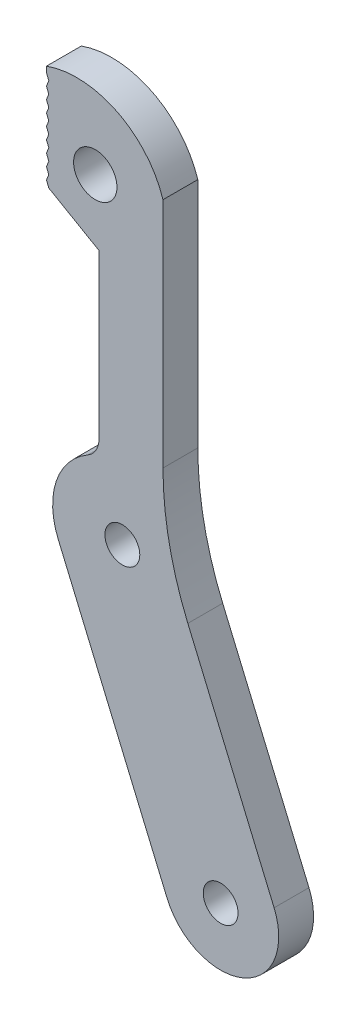
ISO-10303-21;
HEADER;
FILE_DESCRIPTION(('STEP AP214'),'2;1');
FILE_NAME('part.step','',(''),(''),'','','');
FILE_SCHEMA(('AUTOMOTIVE_DESIGN { 1 0 10303 214 1 1 1 1 }'));
ENDSEC;
DATA;
#1=APPLICATION_CONTEXT('core data for automotive mechanical design processes');
#2=APPLICATION_PROTOCOL_DEFINITION('international standard','automotive_design',2000,#1);
#3=PRODUCT_CONTEXT('',#1,'mechanical');
#4=PRODUCT('Part','Part','',(#3));
#5=PRODUCT_RELATED_PRODUCT_CATEGORY('part','',(#4));
#6=PRODUCT_DEFINITION_FORMATION('','',#4);
#7=PRODUCT_DEFINITION_CONTEXT('part definition',#1,'design');
#8=PRODUCT_DEFINITION('design','',#6,#7);
#9=PRODUCT_DEFINITION_SHAPE('','',#8);
#10=(LENGTH_UNIT() NAMED_UNIT(*) SI_UNIT(.MILLI.,.METRE.));
#11=(NAMED_UNIT(*) PLANE_ANGLE_UNIT() SI_UNIT($,.RADIAN.));
#12=(NAMED_UNIT(*) SI_UNIT($,.STERADIAN.) SOLID_ANGLE_UNIT());
#13=UNCERTAINTY_MEASURE_WITH_UNIT(LENGTH_MEASURE(1.E-05),#10,'distance_accuracy_value','');
#14=(GEOMETRIC_REPRESENTATION_CONTEXT(3) GLOBAL_UNCERTAINTY_ASSIGNED_CONTEXT((#13)) GLOBAL_UNIT_ASSIGNED_CONTEXT((#10,
#11,#12)) REPRESENTATION_CONTEXT('',''));
#15=CARTESIAN_POINT('',(0.,0.,0.));
#16=DIRECTION('',(0.,0.,1.));
#17=DIRECTION('',(1.,0.,0.));
#18=AXIS2_PLACEMENT_3D('',#15,#16,#17);
#19=CARTESIAN_POINT('',(18.0463829361262,-3.52698834366382,3.));
#20=DIRECTION('',(0.,0.,-1.));
#21=DIRECTION('',(-1.,0.,0.));
#22=AXIS2_PLACEMENT_3D('',#19,#20,#21);
#23=PLANE('',#22);
#24=DIRECTION('',(0.86602540378444,-0.499999999999998,0.));
#25=VECTOR('',#24,1.);
#26=CARTESIAN_POINT('',(19.9553284785627,-7.68665441141795,3.));
#27=LINE('',#26,#25);
#28=CARTESIAN_POINT('',(15.6252014596405,-5.18665441141796,3.));
#29=VERTEX_POINT('',#28);
#30=CARTESIAN_POINT('',(19.9553284785627,-7.68665441141795,3.));
#31=VERTEX_POINT('',#30);
#32=EDGE_CURVE('E308',#29,#31,#27,.T.);
#33=ORIENTED_EDGE('',*,*,#32,.T.);
#34=DIRECTION('',(0.,-1.,0.));
#35=VECTOR('',#34,1.);
#36=CARTESIAN_POINT('',(19.9553284785627,-21.6866544114179,3.));
#37=LINE('',#36,#35);
#38=CARTESIAN_POINT('',(19.9553284785627,-21.6866544114179,3.));
#39=VERTEX_POINT('',#38);
#40=EDGE_CURVE('E156',#31,#39,#37,.T.);
#41=ORIENTED_EDGE('',*,*,#40,.T.);
#42=CARTESIAN_POINT('',(17.9553284785627,-21.6866544114179,3.));
#43=DIRECTION('',(0.,0.,-1.));
#44=DIRECTION('',(-1.,0.,0.));
#45=AXIS2_PLACEMENT_3D('',#42,#43,#44);
#46=CIRCLE('',#45,2.);
#47=CARTESIAN_POINT('',(18.9561176597661,-23.418249345225,3.));
#48=VERTEX_POINT('',#47);
#49=EDGE_CURVE('E383',#39,#48,#46,.T.);
#50=ORIENTED_EDGE('',*,*,#49,.T.);
#51=CARTESIAN_POINT('',(21.9584852033763,-28.6130341466461,3.));
#52=DIRECTION('',(0.,0.,1.));
#53=DIRECTION('',(1.,0.,0.));
#54=AXIS2_PLACEMENT_3D('',#51,#52,#53);
#55=CIRCLE('',#54,6.);
#56=CARTESIAN_POINT('',(16.4357325722321,-30.9580721794271,3.));
#57=VERTEX_POINT('',#56);
#58=EDGE_CURVE('E402',#48,#57,#55,.T.);
#59=ORIENTED_EDGE('',*,*,#58,.T.);
#60=DIRECTION('',(0.390839672130157,-0.920458771857377,0.));
#61=VECTOR('',#60,1.);
#62=CARTESIAN_POINT('',(16.4357325722321,-30.9580721794271,3.));
#63=LINE('',#62,#61);
#64=CARTESIAN_POINT('',(25.8158847033558,-53.0490827040041,3.));
#65=VERTEX_POINT('',#64);
#66=EDGE_CURVE('E399',#57,#65,#63,.T.);
#67=ORIENTED_EDGE('',*,*,#66,.T.);
#68=CARTESIAN_POINT('',(30.4181785626427,-51.0948843433533,3.));
#69=DIRECTION('',(0.,0.,1.));
#70=DIRECTION('',(1.,0.,0.));
#71=AXIS2_PLACEMENT_3D('',#68,#69,#70);
#72=CIRCLE('',#71,5.);
#73=CARTESIAN_POINT('',(35.0204724219296,-49.1406859827026,3.));
#74=VERTEX_POINT('',#73);
#75=EDGE_CURVE('E401',#65,#74,#72,.T.);
#76=ORIENTED_EDGE('',*,*,#75,.T.);
#77=DIRECTION('',(-0.390839672130157,0.920458771857378,0.));
#78=VECTOR('',#77,1.);
#79=CARTESIAN_POINT('',(35.0204724219296,-49.1406859827026,3.));
#80=LINE('',#79,#78);
#81=CARTESIAN_POINT('',(27.5945186514566,-31.6519693174124,3.));
#82=VERTEX_POINT('',#81);
#83=EDGE_CURVE('E404',#74,#82,#80,.T.);
#84=ORIENTED_EDGE('',*,*,#83,.T.);
#85=CARTESIAN_POINT('',(52.3494338732919,-21.1406859827026,3.));
#86=DIRECTION('',(0.,0.,-1.));
#87=DIRECTION('',(-1.,0.,0.));
#88=AXIS2_PLACEMENT_3D('',#85,#86,#87);
#89=CIRCLE('',#88,26.8941053947292);
#90=CARTESIAN_POINT('',(25.4553284785627,-21.1406859827026,3.));
#91=VERTEX_POINT('',#90);
#92=EDGE_CURVE('E410',#82,#91,#89,.T.);
#93=ORIENTED_EDGE('',*,*,#92,.T.);
#94=DIRECTION('',(0.,1.,0.));
#95=VECTOR('',#94,1.);
#96=CARTESIAN_POINT('',(25.4553284785627,-21.1406859827026,3.));
#97=LINE('',#96,#95);
#98=CARTESIAN_POINT('',(25.4553284785627,-1.14068598270257,3.));
#99=VERTEX_POINT('',#98);
#100=EDGE_CURVE('E412',#91,#99,#97,.T.);
#101=ORIENTED_EDGE('',*,*,#100,.T.);
#102=CARTESIAN_POINT('',(18.0463829361262,-3.52698834366382,3.));
#103=DIRECTION('',(0.,0.,1.));
#104=DIRECTION('',(-1.,0.,0.));
#105=AXIS2_PLACEMENT_3D('',#102,#103,#104);
#106=CIRCLE('',#105,7.78375956776151);
#107=CARTESIAN_POINT('',(15.4252014596405,3.80215353489514,3.));
#108=VERTEX_POINT('',#107);
#109=EDGE_CURVE('E414',#99,#108,#106,.T.);
#110=ORIENTED_EDGE('',*,*,#109,.T.);
#111=DIRECTION('',(0.,-1.,0.));
#112=VECTOR('',#111,1.);
#113=CARTESIAN_POINT('',(15.4252014596405,3.31334558858206,3.));
#114=LINE('',#113,#112);
#115=CARTESIAN_POINT('',(15.4252014596405,3.31334558858206,3.));
#116=VERTEX_POINT('',#115);
#117=EDGE_CURVE('E416',#108,#116,#114,.T.);
#118=ORIENTED_EDGE('',*,*,#117,.T.);
#119=DIRECTION('',(0.371390676354105,-0.928476690885259,0.));
#120=VECTOR('',#119,1.);
#121=CARTESIAN_POINT('',(15.4252014596405,3.31334558858206,3.));
#122=LINE('',#121,#120);
#123=CARTESIAN_POINT('',(15.6252014596405,2.81334558858206,3.));
#124=VERTEX_POINT('',#123);
#125=EDGE_CURVE('E418',#116,#124,#122,.T.);
#126=ORIENTED_EDGE('',*,*,#125,.T.);
#127=DIRECTION('',(-0.371390676354102,-0.92847669088526,0.));
#128=VECTOR('',#127,1.);
#129=CARTESIAN_POINT('',(15.4252014596405,2.31334558858206,3.));
#130=LINE('',#129,#128);
#131=CARTESIAN_POINT('',(15.4252014596405,2.31334558858206,3.));
#132=VERTEX_POINT('',#131);
#133=EDGE_CURVE('E420',#124,#132,#130,.T.);
#134=ORIENTED_EDGE('',*,*,#133,.T.);
#135=DIRECTION('',(0.371390676354105,-0.928476690885259,0.));
#136=VECTOR('',#135,1.);
#137=CARTESIAN_POINT('',(15.4252014596405,2.31334558858206,3.));
#138=LINE('',#137,#136);
#139=CARTESIAN_POINT('',(15.6252014596405,1.81334558858206,3.));
#140=VERTEX_POINT('',#139);
#141=EDGE_CURVE('E422',#132,#140,#138,.T.);
#142=ORIENTED_EDGE('',*,*,#141,.T.);
#143=DIRECTION('',(-0.371390676354102,-0.92847669088526,0.));
#144=VECTOR('',#143,1.);
#145=CARTESIAN_POINT('',(15.4252014596405,1.31334558858206,3.));
#146=LINE('',#145,#144);
#147=CARTESIAN_POINT('',(15.4252014596405,1.31334558858206,3.));
#148=VERTEX_POINT('',#147);
#149=EDGE_CURVE('E424',#140,#148,#146,.T.);
#150=ORIENTED_EDGE('',*,*,#149,.T.);
#151=DIRECTION('',(0.371390676354105,-0.928476690885259,0.));
#152=VECTOR('',#151,1.);
#153=CARTESIAN_POINT('',(15.4252014596405,1.31334558858206,3.));
#154=LINE('',#153,#152);
#155=CARTESIAN_POINT('',(15.6252014596405,0.813345588582054,3.));
#156=VERTEX_POINT('',#155);
#157=EDGE_CURVE('E426',#148,#156,#154,.T.);
#158=ORIENTED_EDGE('',*,*,#157,.T.);
#159=DIRECTION('',(-0.371390676354102,-0.92847669088526,0.));
#160=VECTOR('',#159,1.);
#161=CARTESIAN_POINT('',(15.4252014596405,0.313345588582054,3.));
#162=LINE('',#161,#160);
#163=CARTESIAN_POINT('',(15.4252014596405,0.313345588582054,3.));
#164=VERTEX_POINT('',#163);
#165=EDGE_CURVE('E428',#156,#164,#162,.T.);
#166=ORIENTED_EDGE('',*,*,#165,.T.);
#167=DIRECTION('',(0.371390676354105,-0.928476690885259,0.));
#168=VECTOR('',#167,1.);
#169=CARTESIAN_POINT('',(15.4252014596405,0.313345588582054,3.));
#170=LINE('',#169,#168);
#171=CARTESIAN_POINT('',(15.6252014596405,-0.186654411417949,3.));
#172=VERTEX_POINT('',#171);
#173=EDGE_CURVE('E430',#164,#172,#170,.T.);
#174=ORIENTED_EDGE('',*,*,#173,.T.);
#175=DIRECTION('',(-0.371390676354102,-0.92847669088526,0.));
#176=VECTOR('',#175,1.);
#177=CARTESIAN_POINT('',(15.4252014596405,-0.686654411417948,3.));
#178=LINE('',#177,#176);
#179=CARTESIAN_POINT('',(15.4252014596405,-0.686654411417948,3.));
#180=VERTEX_POINT('',#179);
#181=EDGE_CURVE('E432',#172,#180,#178,.T.);
#182=ORIENTED_EDGE('',*,*,#181,.T.);
#183=DIRECTION('',(0.371390676354105,-0.928476690885259,0.));
#184=VECTOR('',#183,1.);
#185=CARTESIAN_POINT('',(15.4252014596405,-0.686654411417948,3.));
#186=LINE('',#185,#184);
#187=CARTESIAN_POINT('',(15.6252014596405,-1.18665441141795,3.));
#188=VERTEX_POINT('',#187);
#189=EDGE_CURVE('E434',#180,#188,#186,.T.);
#190=ORIENTED_EDGE('',*,*,#189,.T.);
#191=DIRECTION('',(-0.371390676354102,-0.92847669088526,0.));
#192=VECTOR('',#191,1.);
#193=CARTESIAN_POINT('',(15.4252014596405,-1.68665441141795,3.));
#194=LINE('',#193,#192);
#195=CARTESIAN_POINT('',(15.4252014596405,-1.68665441141795,3.));
#196=VERTEX_POINT('',#195);
#197=EDGE_CURVE('E436',#188,#196,#194,.T.);
#198=ORIENTED_EDGE('',*,*,#197,.T.);
#199=DIRECTION('',(0.371390676354105,-0.928476690885259,0.));
#200=VECTOR('',#199,1.);
#201=CARTESIAN_POINT('',(15.4252014596405,-1.68665441141795,3.));
#202=LINE('',#201,#200);
#203=CARTESIAN_POINT('',(15.6252014596405,-2.18665441141796,3.));
#204=VERTEX_POINT('',#203);
#205=EDGE_CURVE('E438',#196,#204,#202,.T.);
#206=ORIENTED_EDGE('',*,*,#205,.T.);
#207=DIRECTION('',(-0.371390676354102,-0.92847669088526,0.));
#208=VECTOR('',#207,1.);
#209=CARTESIAN_POINT('',(15.4252014596405,-2.68665441141795,3.));
#210=LINE('',#209,#208);
#211=CARTESIAN_POINT('',(15.4252014596405,-2.68665441141795,3.));
#212=VERTEX_POINT('',#211);
#213=EDGE_CURVE('E440',#204,#212,#210,.T.);
#214=ORIENTED_EDGE('',*,*,#213,.T.);
#215=DIRECTION('',(0.371390676354105,-0.928476690885259,0.));
#216=VECTOR('',#215,1.);
#217=CARTESIAN_POINT('',(15.4252014596405,-2.68665441141795,3.));
#218=LINE('',#217,#216);
#219=CARTESIAN_POINT('',(15.6252014596405,-3.18665441141796,3.));
#220=VERTEX_POINT('',#219);
#221=EDGE_CURVE('E442',#212,#220,#218,.T.);
#222=ORIENTED_EDGE('',*,*,#221,.T.);
#223=DIRECTION('',(-0.371390676354102,-0.92847669088526,0.));
#224=VECTOR('',#223,1.);
#225=CARTESIAN_POINT('',(15.4252014596405,-3.68665441141796,3.));
#226=LINE('',#225,#224);
#227=CARTESIAN_POINT('',(15.4252014596405,-3.68665441141796,3.));
#228=VERTEX_POINT('',#227);
#229=EDGE_CURVE('E235',#220,#228,#226,.T.);
#230=ORIENTED_EDGE('',*,*,#229,.T.);
#231=DIRECTION('',(0.371390676354105,-0.928476690885259,0.));
#232=VECTOR('',#231,1.);
#233=CARTESIAN_POINT('',(15.4252014596405,-3.68665441141796,3.));
#234=LINE('',#233,#232);
#235=CARTESIAN_POINT('',(15.6252014596405,-4.18665441141796,3.));
#236=VERTEX_POINT('',#235);
#237=EDGE_CURVE('E229',#228,#236,#234,.T.);
#238=ORIENTED_EDGE('',*,*,#237,.T.);
#239=DIRECTION('',(-0.371390676354102,-0.92847669088526,0.));
#240=VECTOR('',#239,1.);
#241=CARTESIAN_POINT('',(15.4252014596405,-4.68665441141796,3.));
#242=LINE('',#241,#240);
#243=CARTESIAN_POINT('',(15.4252014596405,-4.68665441141796,3.));
#244=VERTEX_POINT('',#243);
#245=EDGE_CURVE('E233',#236,#244,#242,.T.);
#246=ORIENTED_EDGE('',*,*,#245,.T.);
#247=DIRECTION('',(0.371390676354102,-0.92847669088526,0.));
#248=VECTOR('',#247,1.);
#249=CARTESIAN_POINT('',(15.4252014596405,-4.68665441141796,3.));
#250=LINE('',#249,#248);
#251=EDGE_CURVE('E53',#244,#29,#250,.T.);
#252=ORIENTED_EDGE('',*,*,#251,.T.);
#253=EDGE_LOOP('',(#33,#41,#50,#59,#67,#76,#84,#93,#101,#110,#118,#126,#134,#142,#150,#158,#166,
#174,#182,#190,#198,#206,#214,#222,#230,#238,#246,#252));
#254=FACE_BOUND('',#253,.T.);
#255=CARTESIAN_POINT('',(21.9584852033763,-28.6130341466461,3.));
#256=DIRECTION('',(0.,0.,1.));
#257=DIRECTION('',(1.,0.,0.));
#258=AXIS2_PLACEMENT_3D('',#255,#256,#257);
#259=CIRCLE('',#258,1.5);
#260=CARTESIAN_POINT('',(23.4584852033763,-28.6130341466461,3.));
#261=VERTEX_POINT('',#260);
#262=EDGE_CURVE('E257',#261,#261,#259,.T.);
#263=ORIENTED_EDGE('',*,*,#262,.F.);
#264=EDGE_LOOP('',(#263));
#265=FACE_BOUND('',#264,.T.);
#266=CARTESIAN_POINT('',(30.4181785626427,-51.0948843433533,3.));
#267=DIRECTION('',(0.,0.,1.));
#268=DIRECTION('',(1.,0.,0.));
#269=AXIS2_PLACEMENT_3D('',#266,#267,#268);
#270=CIRCLE('',#269,1.5);
#271=CARTESIAN_POINT('',(31.9181785626427,-51.0948843433533,3.));
#272=VERTEX_POINT('',#271);
#273=EDGE_CURVE('E496',#272,#272,#270,.T.);
#274=ORIENTED_EDGE('',*,*,#273,.F.);
#275=EDGE_LOOP('',(#274));
#276=FACE_BOUND('',#275,.T.);
#277=CARTESIAN_POINT('',(19.6252014596405,-2.18665441141797,3.));
#278=DIRECTION('',(0.,0.,1.));
#279=DIRECTION('',(1.,0.,0.));
#280=AXIS2_PLACEMENT_3D('',#277,#278,#279);
#281=CIRCLE('',#280,1.86677313911568);
#282=CARTESIAN_POINT('',(21.4919745987562,-2.18665441141797,3.));
#283=VERTEX_POINT('',#282);
#284=EDGE_CURVE('E487',#283,#283,#281,.T.);
#285=ORIENTED_EDGE('',*,*,#284,.F.);
#286=EDGE_LOOP('',(#285));
#287=FACE_BOUND('',#286,.T.);
#288=ADVANCED_FACE('F36',(#254,#265,#276,#287),#23,.F.);
#289=CARTESIAN_POINT('',(18.0463829361262,-3.52698834366382,0.));
#290=DIRECTION('',(0.,0.,-1.));
#291=DIRECTION('',(-1.,0.,0.));
#292=AXIS2_PLACEMENT_3D('',#289,#290,#291);
#293=PLANE('',#292);
#294=CARTESIAN_POINT('',(30.4181785626427,-51.0948843433533,0.));
#295=DIRECTION('',(0.,0.,1.));
#296=DIRECTION('',(1.,0.,0.));
#297=AXIS2_PLACEMENT_3D('',#294,#295,#296);
#298=CIRCLE('',#297,1.5);
#299=CARTESIAN_POINT('',(31.9181785626427,-51.0948843433533,0.));
#300=VERTEX_POINT('',#299);
#301=EDGE_CURVE('E493',#300,#300,#298,.T.);
#302=ORIENTED_EDGE('',*,*,#301,.T.);
#303=EDGE_LOOP('',(#302));
#304=FACE_BOUND('',#303,.T.);
#305=DIRECTION('',(0.86602540378444,-0.499999999999998,0.));
#306=VECTOR('',#305,1.);
#307=CARTESIAN_POINT('',(19.9553284785627,-7.68665441141795,0.));
#308=LINE('',#307,#306);
#309=CARTESIAN_POINT('',(15.6252014596405,-5.18665441141796,0.));
#310=VERTEX_POINT('',#309);
#311=CARTESIAN_POINT('',(19.9553284785627,-7.68665441141795,0.));
#312=VERTEX_POINT('',#311);
#313=EDGE_CURVE('E253',#310,#312,#308,.T.);
#314=ORIENTED_EDGE('',*,*,#313,.F.);
#315=DIRECTION('',(0.371390676354102,-0.92847669088526,0.));
#316=VECTOR('',#315,1.);
#317=CARTESIAN_POINT('',(15.4252014596405,-4.68665441141796,0.));
#318=LINE('',#317,#316);
#319=CARTESIAN_POINT('',(15.4252014596405,-4.68665441141796,0.));
#320=VERTEX_POINT('',#319);
#321=EDGE_CURVE('E148',#320,#310,#318,.T.);
#322=ORIENTED_EDGE('',*,*,#321,.F.);
#323=DIRECTION('',(-0.371390676354102,-0.92847669088526,0.));
#324=VECTOR('',#323,1.);
#325=CARTESIAN_POINT('',(15.4252014596405,-4.68665441141796,0.));
#326=LINE('',#325,#324);
#327=CARTESIAN_POINT('',(15.6252014596405,-4.18665441141796,0.));
#328=VERTEX_POINT('',#327);
#329=EDGE_CURVE('E142',#328,#320,#326,.T.);
#330=ORIENTED_EDGE('',*,*,#329,.F.);
#331=DIRECTION('',(0.371390676354105,-0.928476690885259,0.));
#332=VECTOR('',#331,1.);
#333=CARTESIAN_POINT('',(15.4252014596405,-3.68665441141796,0.));
#334=LINE('',#333,#332);
#335=CARTESIAN_POINT('',(15.4252014596405,-3.68665441141796,0.));
#336=VERTEX_POINT('',#335);
#337=EDGE_CURVE('E243',#336,#328,#334,.T.);
#338=ORIENTED_EDGE('',*,*,#337,.F.);
#339=DIRECTION('',(-0.371390676354102,-0.92847669088526,0.));
#340=VECTOR('',#339,1.);
#341=CARTESIAN_POINT('',(15.4252014596405,-3.68665441141796,0.));
#342=LINE('',#341,#340);
#343=CARTESIAN_POINT('',(15.6252014596405,-3.18665441141796,0.));
#344=VERTEX_POINT('',#343);
#345=EDGE_CURVE('E303',#344,#336,#342,.T.);
#346=ORIENTED_EDGE('',*,*,#345,.F.);
#347=DIRECTION('',(0.371390676354105,-0.928476690885259,0.));
#348=VECTOR('',#347,1.);
#349=CARTESIAN_POINT('',(15.4252014596405,-2.68665441141795,0.));
#350=LINE('',#349,#348);
#351=CARTESIAN_POINT('',(15.4252014596405,-2.68665441141795,0.));
#352=VERTEX_POINT('',#351);
#353=EDGE_CURVE('E301',#352,#344,#350,.T.);
#354=ORIENTED_EDGE('',*,*,#353,.F.);
#355=DIRECTION('',(-0.371390676354102,-0.92847669088526,0.));
#356=VECTOR('',#355,1.);
#357=CARTESIAN_POINT('',(15.4252014596405,-2.68665441141795,0.));
#358=LINE('',#357,#356);
#359=CARTESIAN_POINT('',(15.6252014596405,-2.18665441141796,0.));
#360=VERTEX_POINT('',#359);
#361=EDGE_CURVE('E299',#360,#352,#358,.T.);
#362=ORIENTED_EDGE('',*,*,#361,.F.);
#363=DIRECTION('',(0.371390676354105,-0.928476690885259,0.));
#364=VECTOR('',#363,1.);
#365=CARTESIAN_POINT('',(15.4252014596405,-1.68665441141795,0.));
#366=LINE('',#365,#364);
#367=CARTESIAN_POINT('',(15.4252014596405,-1.68665441141795,0.));
#368=VERTEX_POINT('',#367);
#369=EDGE_CURVE('E297',#368,#360,#366,.T.);
#370=ORIENTED_EDGE('',*,*,#369,.F.);
#371=DIRECTION('',(-0.371390676354102,-0.92847669088526,0.));
#372=VECTOR('',#371,1.);
#373=CARTESIAN_POINT('',(15.4252014596405,-1.68665441141795,0.));
#374=LINE('',#373,#372);
#375=CARTESIAN_POINT('',(15.6252014596405,-1.18665441141795,0.));
#376=VERTEX_POINT('',#375);
#377=EDGE_CURVE('E295',#376,#368,#374,.T.);
#378=ORIENTED_EDGE('',*,*,#377,.F.);
#379=DIRECTION('',(0.371390676354105,-0.928476690885259,0.));
#380=VECTOR('',#379,1.);
#381=CARTESIAN_POINT('',(15.4252014596405,-0.686654411417948,0.));
#382=LINE('',#381,#380);
#383=CARTESIAN_POINT('',(15.4252014596405,-0.686654411417948,0.));
#384=VERTEX_POINT('',#383);
#385=EDGE_CURVE('E293',#384,#376,#382,.T.);
#386=ORIENTED_EDGE('',*,*,#385,.F.);
#387=DIRECTION('',(-0.371390676354102,-0.92847669088526,0.));
#388=VECTOR('',#387,1.);
#389=CARTESIAN_POINT('',(15.4252014596405,-0.686654411417948,0.));
#390=LINE('',#389,#388);
#391=CARTESIAN_POINT('',(15.6252014596405,-0.186654411417949,0.));
#392=VERTEX_POINT('',#391);
#393=EDGE_CURVE('E291',#392,#384,#390,.T.);
#394=ORIENTED_EDGE('',*,*,#393,.F.);
#395=DIRECTION('',(0.371390676354105,-0.928476690885259,0.));
#396=VECTOR('',#395,1.);
#397=CARTESIAN_POINT('',(15.4252014596405,0.313345588582054,0.));
#398=LINE('',#397,#396);
#399=CARTESIAN_POINT('',(15.4252014596405,0.313345588582054,0.));
#400=VERTEX_POINT('',#399);
#401=EDGE_CURVE('E289',#400,#392,#398,.T.);
#402=ORIENTED_EDGE('',*,*,#401,.F.);
#403=DIRECTION('',(-0.371390676354102,-0.92847669088526,0.));
#404=VECTOR('',#403,1.);
#405=CARTESIAN_POINT('',(15.4252014596405,0.313345588582054,0.));
#406=LINE('',#405,#404);
#407=CARTESIAN_POINT('',(15.6252014596405,0.813345588582054,0.));
#408=VERTEX_POINT('',#407);
#409=EDGE_CURVE('E287',#408,#400,#406,.T.);
#410=ORIENTED_EDGE('',*,*,#409,.F.);
#411=DIRECTION('',(0.371390676354105,-0.928476690885259,0.));
#412=VECTOR('',#411,1.);
#413=CARTESIAN_POINT('',(15.4252014596405,1.31334558858206,0.));
#414=LINE('',#413,#412);
#415=CARTESIAN_POINT('',(15.4252014596405,1.31334558858206,0.));
#416=VERTEX_POINT('',#415);
#417=EDGE_CURVE('E285',#416,#408,#414,.T.);
#418=ORIENTED_EDGE('',*,*,#417,.F.);
#419=DIRECTION('',(-0.371390676354102,-0.92847669088526,0.));
#420=VECTOR('',#419,1.);
#421=CARTESIAN_POINT('',(15.4252014596405,1.31334558858206,0.));
#422=LINE('',#421,#420);
#423=CARTESIAN_POINT('',(15.6252014596405,1.81334558858206,0.));
#424=VERTEX_POINT('',#423);
#425=EDGE_CURVE('E283',#424,#416,#422,.T.);
#426=ORIENTED_EDGE('',*,*,#425,.F.);
#427=DIRECTION('',(0.371390676354105,-0.928476690885259,0.));
#428=VECTOR('',#427,1.);
#429=CARTESIAN_POINT('',(15.4252014596405,2.31334558858206,0.));
#430=LINE('',#429,#428);
#431=CARTESIAN_POINT('',(15.4252014596405,2.31334558858206,0.));
#432=VERTEX_POINT('',#431);
#433=EDGE_CURVE('E281',#432,#424,#430,.T.);
#434=ORIENTED_EDGE('',*,*,#433,.F.);
#435=DIRECTION('',(-0.371390676354102,-0.92847669088526,0.));
#436=VECTOR('',#435,1.);
#437=CARTESIAN_POINT('',(15.4252014596405,2.31334558858206,0.));
#438=LINE('',#437,#436);
#439=CARTESIAN_POINT('',(15.6252014596405,2.81334558858206,0.));
#440=VERTEX_POINT('',#439);
#441=EDGE_CURVE('E279',#440,#432,#438,.T.);
#442=ORIENTED_EDGE('',*,*,#441,.F.);
#443=DIRECTION('',(0.371390676354105,-0.928476690885259,0.));
#444=VECTOR('',#443,1.);
#445=CARTESIAN_POINT('',(15.4252014596405,3.31334558858206,0.));
#446=LINE('',#445,#444);
#447=CARTESIAN_POINT('',(15.4252014596405,3.31334558858206,0.));
#448=VERTEX_POINT('',#447);
#449=EDGE_CURVE('E277',#448,#440,#446,.T.);
#450=ORIENTED_EDGE('',*,*,#449,.F.);
#451=DIRECTION('',(0.,-1.,0.));
#452=VECTOR('',#451,1.);
#453=CARTESIAN_POINT('',(15.4252014596405,3.31334558858206,0.));
#454=LINE('',#453,#452);
#455=CARTESIAN_POINT('',(15.4252014596405,3.80215353489514,0.));
#456=VERTEX_POINT('',#455);
#457=EDGE_CURVE('E275',#456,#448,#454,.T.);
#458=ORIENTED_EDGE('',*,*,#457,.F.);
#459=CARTESIAN_POINT('',(18.0463829361262,-3.52698834366382,0.));
#460=DIRECTION('',(0.,0.,1.));
#461=DIRECTION('',(-1.,0.,0.));
#462=AXIS2_PLACEMENT_3D('',#459,#460,#461);
#463=CIRCLE('',#462,7.78375956776151);
#464=CARTESIAN_POINT('',(25.4553284785627,-1.14068598270257,0.));
#465=VERTEX_POINT('',#464);
#466=EDGE_CURVE('E273',#465,#456,#463,.T.);
#467=ORIENTED_EDGE('',*,*,#466,.F.);
#468=DIRECTION('',(0.,1.,0.));
#469=VECTOR('',#468,1.);
#470=CARTESIAN_POINT('',(25.4553284785627,-21.1406859827026,0.));
#471=LINE('',#470,#469);
#472=CARTESIAN_POINT('',(25.4553284785627,-21.1406859827026,0.));
#473=VERTEX_POINT('',#472);
#474=EDGE_CURVE('E271',#473,#465,#471,.T.);
#475=ORIENTED_EDGE('',*,*,#474,.F.);
#476=CARTESIAN_POINT('',(52.3494338732919,-21.1406859827026,0.));
#477=DIRECTION('',(0.,0.,-1.));
#478=DIRECTION('',(-1.,0.,0.));
#479=AXIS2_PLACEMENT_3D('',#476,#477,#478);
#480=CIRCLE('',#479,26.8941053947292);
#481=CARTESIAN_POINT('',(27.5945186514566,-31.6519693174124,0.));
#482=VERTEX_POINT('',#481);
#483=EDGE_CURVE('E269',#482,#473,#480,.T.);
#484=ORIENTED_EDGE('',*,*,#483,.F.);
#485=DIRECTION('',(-0.390839672130157,0.920458771857378,0.));
#486=VECTOR('',#485,1.);
#487=CARTESIAN_POINT('',(35.0204724219296,-49.1406859827026,0.));
#488=LINE('',#487,#486);
#489=CARTESIAN_POINT('',(35.0204724219296,-49.1406859827026,0.));
#490=VERTEX_POINT('',#489);
#491=EDGE_CURVE('E267',#490,#482,#488,.T.);
#492=ORIENTED_EDGE('',*,*,#491,.F.);
#493=CARTESIAN_POINT('',(30.4181785626427,-51.0948843433533,0.));
#494=DIRECTION('',(0.,0.,1.));
#495=DIRECTION('',(1.,0.,0.));
#496=AXIS2_PLACEMENT_3D('',#493,#494,#495);
#497=CIRCLE('',#496,5.);
#498=CARTESIAN_POINT('',(25.8158847033558,-53.0490827040041,0.));
#499=VERTEX_POINT('',#498);
#500=EDGE_CURVE('E265',#499,#490,#497,.T.);
#501=ORIENTED_EDGE('',*,*,#500,.F.);
#502=DIRECTION('',(0.390839672130157,-0.920458771857377,0.));
#503=VECTOR('',#502,1.);
#504=CARTESIAN_POINT('',(16.4357325722321,-30.9580721794271,0.));
#505=LINE('',#504,#503);
#506=CARTESIAN_POINT('',(16.4357325722321,-30.9580721794271,0.));
#507=VERTEX_POINT('',#506);
#508=EDGE_CURVE('E263',#507,#499,#505,.T.);
#509=ORIENTED_EDGE('',*,*,#508,.F.);
#510=CARTESIAN_POINT('',(21.9584852033763,-28.6130341466461,0.));
#511=DIRECTION('',(0.,0.,1.));
#512=DIRECTION('',(1.,0.,0.));
#513=AXIS2_PLACEMENT_3D('',#510,#511,#512);
#514=CIRCLE('',#513,6.);
#515=CARTESIAN_POINT('',(18.9561176597661,-23.418249345225,0.));
#516=VERTEX_POINT('',#515);
#517=EDGE_CURVE('E261',#516,#507,#514,.T.);
#518=ORIENTED_EDGE('',*,*,#517,.F.);
#519=CARTESIAN_POINT('',(17.9553284785627,-21.6866544114179,0.));
#520=DIRECTION('',(0.,0.,-1.));
#521=DIRECTION('',(-1.,0.,0.));
#522=AXIS2_PLACEMENT_3D('',#519,#520,#521);
#523=CIRCLE('',#522,2.);
#524=CARTESIAN_POINT('',(19.9553284785627,-21.6866544114179,0.));
#525=VERTEX_POINT('',#524);
#526=EDGE_CURVE('E259',#525,#516,#523,.T.);
#527=ORIENTED_EDGE('',*,*,#526,.F.);
#528=DIRECTION('',(0.,-1.,0.));
#529=VECTOR('',#528,1.);
#530=CARTESIAN_POINT('',(19.9553284785627,-21.6866544114179,0.));
#531=LINE('',#530,#529);
#532=EDGE_CURVE('E256',#312,#525,#531,.T.);
#533=ORIENTED_EDGE('',*,*,#532,.F.);
#534=EDGE_LOOP('',(#314,#322,#330,#338,#346,#354,#362,#370,#378,#386,#394,#402,#410,#418,#426,
#434,#442,#450,#458,#467,#475,#484,#492,#501,#509,#518,#527,#533));
#535=FACE_BOUND('',#534,.T.);
#536=CARTESIAN_POINT('',(21.9584852033763,-28.6130341466461,0.));
#537=DIRECTION('',(0.,0.,1.));
#538=DIRECTION('',(1.,0.,0.));
#539=AXIS2_PLACEMENT_3D('',#536,#537,#538);
#540=CIRCLE('',#539,1.5);
#541=CARTESIAN_POINT('',(23.4584852033763,-28.6130341466461,0.));
#542=VERTEX_POINT('',#541);
#543=EDGE_CURVE('E499',#542,#542,#540,.T.);
#544=ORIENTED_EDGE('',*,*,#543,.T.);
#545=EDGE_LOOP('',(#544));
#546=FACE_BOUND('',#545,.T.);
#547=CARTESIAN_POINT('',(19.6252014596405,-2.18665441141797,0.));
#548=DIRECTION('',(0.,0.,1.));
#549=DIRECTION('',(1.,0.,0.));
#550=AXIS2_PLACEMENT_3D('',#547,#548,#549);
#551=CIRCLE('',#550,1.86677313911568);
#552=CARTESIAN_POINT('',(21.4919745987562,-2.18665441141797,0.));
#553=VERTEX_POINT('',#552);
#554=EDGE_CURVE('E490',#553,#553,#551,.T.);
#555=ORIENTED_EDGE('',*,*,#554,.T.);
#556=EDGE_LOOP('',(#555));
#557=FACE_BOUND('',#556,.T.);
#558=ADVANCED_FACE('F387',(#304,#535,#546,#557),#293,.T.);
#559=CARTESIAN_POINT('',(19.9553284785627,-7.68665441141795,3.));
#560=DIRECTION('',(0.499999999999998,0.86602540378444,0.));
#561=DIRECTION('',(-0.86602540378444,0.499999999999998,0.));
#562=AXIS2_PLACEMENT_3D('',#559,#560,#561);
#563=PLANE('',#562);
#564=ORIENTED_EDGE('',*,*,#313,.T.);
#565=DIRECTION('',(0.,0.,-1.));
#566=VECTOR('',#565,1.);
#567=CARTESIAN_POINT('',(19.9553284785627,-7.68665441141795,3.));
#568=LINE('',#567,#566);
#569=EDGE_CURVE('E11',#31,#312,#568,.T.);
#570=ORIENTED_EDGE('',*,*,#569,.F.);
#571=ORIENTED_EDGE('',*,*,#32,.F.);
#572=DIRECTION('',(0.,0.,-1.));
#573=VECTOR('',#572,1.);
#574=CARTESIAN_POINT('',(15.6252014596405,-5.18665441141796,3.));
#575=LINE('',#574,#573);
#576=EDGE_CURVE('E249',#29,#310,#575,.T.);
#577=ORIENTED_EDGE('',*,*,#576,.T.);
#578=EDGE_LOOP('',(#564,#570,#571,#577));
#579=FACE_BOUND('',#578,.T.);
#580=ADVANCED_FACE('F38',(#579),#563,.F.);
#581=CARTESIAN_POINT('',(19.9553284785627,-21.6866544114179,3.));
#582=DIRECTION('',(1.,0.,0.));
#583=DIRECTION('',(0.,1.,0.));
#584=AXIS2_PLACEMENT_3D('',#581,#582,#583);
#585=PLANE('',#584);
#586=ORIENTED_EDGE('',*,*,#532,.T.);
#587=DIRECTION('',(0.,0.,-1.));
#588=VECTOR('',#587,1.);
#589=CARTESIAN_POINT('',(19.9553284785627,-21.6866544114179,3.));
#590=LINE('',#589,#588);
#591=EDGE_CURVE('E45',#39,#525,#590,.T.);
#592=ORIENTED_EDGE('',*,*,#591,.F.);
#593=ORIENTED_EDGE('',*,*,#40,.F.);
#594=ORIENTED_EDGE('',*,*,#569,.T.);
#595=EDGE_LOOP('',(#586,#592,#593,#594));
#596=FACE_BOUND('',#595,.T.);
#597=ADVANCED_FACE('F762',(#596),#585,.F.);
#598=CARTESIAN_POINT('',(17.9553284785627,-21.6866544114179,3.));
#599=DIRECTION('',(0.,0.,-1.));
#600=DIRECTION('',(-1.,0.,0.));
#601=AXIS2_PLACEMENT_3D('',#598,#599,#600);
#602=CYLINDRICAL_SURFACE('',#601,2.);
#603=ORIENTED_EDGE('',*,*,#526,.T.);
#604=DIRECTION('',(0.,0.,-1.));
#605=VECTOR('',#604,1.);
#606=CARTESIAN_POINT('',(18.9561176597661,-23.418249345225,3.));
#607=LINE('',#606,#605);
#608=EDGE_CURVE('E375',#48,#516,#607,.T.);
#609=ORIENTED_EDGE('',*,*,#608,.F.);
#610=ORIENTED_EDGE('',*,*,#49,.F.);
#611=ORIENTED_EDGE('',*,*,#591,.T.);
#612=EDGE_LOOP('',(#603,#609,#610,#611));
#613=FACE_BOUND('',#612,.T.);
#614=ADVANCED_FACE('F381',(#613),#602,.F.);
#615=CARTESIAN_POINT('',(21.9584852033763,-28.6130341466461,3.));
#616=DIRECTION('',(0.,0.,-1.));
#617=DIRECTION('',(-1.,0.,0.));
#618=AXIS2_PLACEMENT_3D('',#615,#616,#617);
#619=CYLINDRICAL_SURFACE('',#618,6.);
#620=ORIENTED_EDGE('',*,*,#517,.T.);
#621=DIRECTION('',(0.,0.,-1.));
#622=VECTOR('',#621,1.);
#623=CARTESIAN_POINT('',(16.4357325722321,-30.9580721794271,3.));
#624=LINE('',#623,#622);
#625=EDGE_CURVE('E372',#57,#507,#624,.T.);
#626=ORIENTED_EDGE('',*,*,#625,.F.);
#627=ORIENTED_EDGE('',*,*,#58,.F.);
#628=ORIENTED_EDGE('',*,*,#608,.T.);
#629=EDGE_LOOP('',(#620,#626,#627,#628));
#630=FACE_BOUND('',#629,.T.);
#631=ADVANCED_FACE('F393',(#630),#619,.T.);
#632=CARTESIAN_POINT('',(16.4357325722321,-30.9580721794271,3.));
#633=DIRECTION('',(0.920458771857377,0.390839672130157,0.));
#634=DIRECTION('',(-0.390839672130157,0.920458771857378,0.));
#635=AXIS2_PLACEMENT_3D('',#632,#633,#634);
#636=PLANE('',#635);
#637=ORIENTED_EDGE('',*,*,#508,.T.);
#638=DIRECTION('',(0.,0.,-1.));
#639=VECTOR('',#638,1.);
#640=CARTESIAN_POINT('',(25.8158847033558,-53.0490827040041,3.));
#641=LINE('',#640,#639);
#642=EDGE_CURVE('E369',#65,#499,#641,.T.);
#643=ORIENTED_EDGE('',*,*,#642,.F.);
#644=ORIENTED_EDGE('',*,*,#66,.F.);
#645=ORIENTED_EDGE('',*,*,#625,.T.);
#646=EDGE_LOOP('',(#637,#643,#644,#645));
#647=FACE_BOUND('',#646,.T.);
#648=ADVANCED_FACE('F397',(#647),#636,.F.);
#649=CARTESIAN_POINT('',(30.4181785626427,-51.0948843433533,3.));
#650=DIRECTION('',(0.,0.,-1.));
#651=DIRECTION('',(-1.,0.,0.));
#652=AXIS2_PLACEMENT_3D('',#649,#650,#651);
#653=CYLINDRICAL_SURFACE('',#652,5.);
#654=ORIENTED_EDGE('',*,*,#500,.T.);
#655=DIRECTION('',(0.,0.,-1.));
#656=VECTOR('',#655,1.);
#657=CARTESIAN_POINT('',(35.0204724219296,-49.1406859827026,3.));
#658=LINE('',#657,#656);
#659=EDGE_CURVE('E366',#74,#490,#658,.T.);
#660=ORIENTED_EDGE('',*,*,#659,.F.);
#661=ORIENTED_EDGE('',*,*,#75,.F.);
#662=ORIENTED_EDGE('',*,*,#642,.T.);
#663=EDGE_LOOP('',(#654,#660,#661,#662));
#664=FACE_BOUND('',#663,.T.);
#665=ADVANCED_FACE('F727',(#664),#653,.T.);
#666=CARTESIAN_POINT('',(35.0204724219296,-49.1406859827026,3.));
#667=DIRECTION('',(-0.920458771857377,-0.390839672130157,0.));
#668=DIRECTION('',(0.390839672130157,-0.920458771857377,0.));
#669=AXIS2_PLACEMENT_3D('',#666,#667,#668);
#670=PLANE('',#669);
#671=ORIENTED_EDGE('',*,*,#491,.T.);
#672=DIRECTION('',(0.,0.,-1.));
#673=VECTOR('',#672,1.);
#674=CARTESIAN_POINT('',(27.5945186514566,-31.6519693174124,3.));
#675=LINE('',#674,#673);
#676=EDGE_CURVE('E363',#82,#482,#675,.T.);
#677=ORIENTED_EDGE('',*,*,#676,.F.);
#678=ORIENTED_EDGE('',*,*,#83,.F.);
#679=ORIENTED_EDGE('',*,*,#659,.T.);
#680=EDGE_LOOP('',(#671,#677,#678,#679));
#681=FACE_BOUND('',#680,.T.);
#682=ADVANCED_FACE('F717',(#681),#670,.F.);
#683=CARTESIAN_POINT('',(52.3494338732919,-21.1406859827026,3.));
#684=DIRECTION('',(0.,0.,-1.));
#685=DIRECTION('',(-1.,0.,0.));
#686=AXIS2_PLACEMENT_3D('',#683,#684,#685);
#687=CYLINDRICAL_SURFACE('',#686,26.8941053947292);
#688=ORIENTED_EDGE('',*,*,#483,.T.);
#689=DIRECTION('',(0.,0.,-1.));
#690=VECTOR('',#689,1.);
#691=CARTESIAN_POINT('',(25.4553284785627,-21.1406859827026,3.));
#692=LINE('',#691,#690);
#693=EDGE_CURVE('E360',#91,#473,#692,.T.);
#694=ORIENTED_EDGE('',*,*,#693,.F.);
#695=ORIENTED_EDGE('',*,*,#92,.F.);
#696=ORIENTED_EDGE('',*,*,#676,.T.);
#697=EDGE_LOOP('',(#688,#694,#695,#696));
#698=FACE_BOUND('',#697,.T.);
#699=ADVANCED_FACE('F707',(#698),#687,.F.);
#700=CARTESIAN_POINT('',(25.4553284785627,-21.1406859827026,3.));
#701=DIRECTION('',(-1.,0.,0.));
#702=DIRECTION('',(0.,0.,1.));
#703=AXIS2_PLACEMENT_3D('',#700,#701,#702);
#704=PLANE('',#703);
#705=ORIENTED_EDGE('',*,*,#474,.T.);
#706=DIRECTION('',(0.,0.,-1.));
#707=VECTOR('',#706,1.);
#708=CARTESIAN_POINT('',(25.4553284785627,-1.14068598270257,3.));
#709=LINE('',#708,#707);
#710=EDGE_CURVE('E357',#99,#465,#709,.T.);
#711=ORIENTED_EDGE('',*,*,#710,.F.);
#712=ORIENTED_EDGE('',*,*,#100,.F.);
#713=ORIENTED_EDGE('',*,*,#693,.T.);
#714=EDGE_LOOP('',(#705,#711,#712,#713));
#715=FACE_BOUND('',#714,.T.);
#716=ADVANCED_FACE('F697',(#715),#704,.F.);
#717=CARTESIAN_POINT('',(18.0463829361262,-3.52698834366382,3.));
#718=DIRECTION('',(0.,0.,-1.));
#719=DIRECTION('',(-1.,0.,0.));
#720=AXIS2_PLACEMENT_3D('',#717,#718,#719);
#721=CYLINDRICAL_SURFACE('',#720,7.78375956776151);
#722=ORIENTED_EDGE('',*,*,#466,.T.);
#723=DIRECTION('',(0.,0.,-1.));
#724=VECTOR('',#723,1.);
#725=CARTESIAN_POINT('',(15.4252014596405,3.80215353489514,3.));
#726=LINE('',#725,#724);
#727=EDGE_CURVE('E354',#108,#456,#726,.T.);
#728=ORIENTED_EDGE('',*,*,#727,.F.);
#729=ORIENTED_EDGE('',*,*,#109,.F.);
#730=ORIENTED_EDGE('',*,*,#710,.T.);
#731=EDGE_LOOP('',(#722,#728,#729,#730));
#732=FACE_BOUND('',#731,.T.);
#733=ADVANCED_FACE('F687',(#732),#721,.T.);
#734=CARTESIAN_POINT('',(15.4252014596405,3.31334558858206,3.));
#735=DIRECTION('',(1.,0.,0.));
#736=DIRECTION('',(0.,0.,-1.));
#737=AXIS2_PLACEMENT_3D('',#734,#735,#736);
#738=PLANE('',#737);
#739=ORIENTED_EDGE('',*,*,#457,.T.);
#740=DIRECTION('',(0.,0.,-1.));
#741=VECTOR('',#740,1.);
#742=CARTESIAN_POINT('',(15.4252014596405,3.31334558858206,3.));
#743=LINE('',#742,#741);
#744=EDGE_CURVE('E351',#116,#448,#743,.T.);
#745=ORIENTED_EDGE('',*,*,#744,.F.);
#746=ORIENTED_EDGE('',*,*,#117,.F.);
#747=ORIENTED_EDGE('',*,*,#727,.T.);
#748=EDGE_LOOP('',(#739,#745,#746,#747));
#749=FACE_BOUND('',#748,.T.);
#750=ADVANCED_FACE('F677',(#749),#738,.F.);
#751=CARTESIAN_POINT('',(15.4252014596405,3.31334558858206,3.));
#752=DIRECTION('',(0.928476690885259,0.371390676354105,0.));
#753=DIRECTION('',(-0.371390676354105,0.928476690885259,0.));
#754=AXIS2_PLACEMENT_3D('',#751,#752,#753);
#755=PLANE('',#754);
#756=ORIENTED_EDGE('',*,*,#449,.T.);
#757=DIRECTION('',(0.,0.,-1.));
#758=VECTOR('',#757,1.);
#759=CARTESIAN_POINT('',(15.6252014596405,2.81334558858206,3.));
#760=LINE('',#759,#758);
#761=EDGE_CURVE('E348',#124,#440,#760,.T.);
#762=ORIENTED_EDGE('',*,*,#761,.F.);
#763=ORIENTED_EDGE('',*,*,#125,.F.);
#764=ORIENTED_EDGE('',*,*,#744,.T.);
#765=EDGE_LOOP('',(#756,#762,#763,#764));
#766=FACE_BOUND('',#765,.T.);
#767=ADVANCED_FACE('F667',(#766),#755,.F.);
#768=CARTESIAN_POINT('',(15.4252014596405,2.31334558858206,3.));
#769=DIRECTION('',(0.92847669088526,-0.371390676354102,0.));
#770=DIRECTION('',(0.371390676354102,0.92847669088526,0.));
#771=AXIS2_PLACEMENT_3D('',#768,#769,#770);
#772=PLANE('',#771);
#773=ORIENTED_EDGE('',*,*,#441,.T.);
#774=DIRECTION('',(0.,0.,-1.));
#775=VECTOR('',#774,1.);
#776=CARTESIAN_POINT('',(15.4252014596405,2.31334558858206,3.));
#777=LINE('',#776,#775);
#778=EDGE_CURVE('E345',#132,#432,#777,.T.);
#779=ORIENTED_EDGE('',*,*,#778,.F.);
#780=ORIENTED_EDGE('',*,*,#133,.F.);
#781=ORIENTED_EDGE('',*,*,#761,.T.);
#782=EDGE_LOOP('',(#773,#779,#780,#781));
#783=FACE_BOUND('',#782,.T.);
#784=ADVANCED_FACE('F657',(#783),#772,.F.);
#785=CARTESIAN_POINT('',(15.4252014596405,2.31334558858206,3.));
#786=DIRECTION('',(0.928476690885259,0.371390676354105,0.));
#787=DIRECTION('',(-0.371390676354105,0.928476690885259,0.));
#788=AXIS2_PLACEMENT_3D('',#785,#786,#787);
#789=PLANE('',#788);
#790=ORIENTED_EDGE('',*,*,#433,.T.);
#791=DIRECTION('',(0.,0.,-1.));
#792=VECTOR('',#791,1.);
#793=CARTESIAN_POINT('',(15.6252014596405,1.81334558858206,3.));
#794=LINE('',#793,#792);
#795=EDGE_CURVE('E342',#140,#424,#794,.T.);
#796=ORIENTED_EDGE('',*,*,#795,.F.);
#797=ORIENTED_EDGE('',*,*,#141,.F.);
#798=ORIENTED_EDGE('',*,*,#778,.T.);
#799=EDGE_LOOP('',(#790,#796,#797,#798));
#800=FACE_BOUND('',#799,.T.);
#801=ADVANCED_FACE('F647',(#800),#789,.F.);
#802=CARTESIAN_POINT('',(15.4252014596405,1.31334558858206,3.));
#803=DIRECTION('',(0.92847669088526,-0.371390676354102,0.));
#804=DIRECTION('',(0.371390676354102,0.92847669088526,0.));
#805=AXIS2_PLACEMENT_3D('',#802,#803,#804);
#806=PLANE('',#805);
#807=ORIENTED_EDGE('',*,*,#425,.T.);
#808=DIRECTION('',(0.,0.,-1.));
#809=VECTOR('',#808,1.);
#810=CARTESIAN_POINT('',(15.4252014596405,1.31334558858206,3.));
#811=LINE('',#810,#809);
#812=EDGE_CURVE('E339',#148,#416,#811,.T.);
#813=ORIENTED_EDGE('',*,*,#812,.F.);
#814=ORIENTED_EDGE('',*,*,#149,.F.);
#815=ORIENTED_EDGE('',*,*,#795,.T.);
#816=EDGE_LOOP('',(#807,#813,#814,#815));
#817=FACE_BOUND('',#816,.T.);
#818=ADVANCED_FACE('F637',(#817),#806,.F.);
#819=CARTESIAN_POINT('',(15.4252014596405,1.31334558858206,3.));
#820=DIRECTION('',(0.928476690885259,0.371390676354105,0.));
#821=DIRECTION('',(-0.371390676354105,0.928476690885259,0.));
#822=AXIS2_PLACEMENT_3D('',#819,#820,#821);
#823=PLANE('',#822);
#824=ORIENTED_EDGE('',*,*,#417,.T.);
#825=DIRECTION('',(0.,0.,-1.));
#826=VECTOR('',#825,1.);
#827=CARTESIAN_POINT('',(15.6252014596405,0.813345588582054,3.));
#828=LINE('',#827,#826);
#829=EDGE_CURVE('E336',#156,#408,#828,.T.);
#830=ORIENTED_EDGE('',*,*,#829,.F.);
#831=ORIENTED_EDGE('',*,*,#157,.F.);
#832=ORIENTED_EDGE('',*,*,#812,.T.);
#833=EDGE_LOOP('',(#824,#830,#831,#832));
#834=FACE_BOUND('',#833,.T.);
#835=ADVANCED_FACE('F627',(#834),#823,.F.);
#836=CARTESIAN_POINT('',(15.4252014596405,0.313345588582054,3.));
#837=DIRECTION('',(0.92847669088526,-0.371390676354102,0.));
#838=DIRECTION('',(0.371390676354102,0.92847669088526,0.));
#839=AXIS2_PLACEMENT_3D('',#836,#837,#838);
#840=PLANE('',#839);
#841=ORIENTED_EDGE('',*,*,#409,.T.);
#842=DIRECTION('',(0.,0.,-1.));
#843=VECTOR('',#842,1.);
#844=CARTESIAN_POINT('',(15.4252014596405,0.313345588582054,3.));
#845=LINE('',#844,#843);
#846=EDGE_CURVE('E333',#164,#400,#845,.T.);
#847=ORIENTED_EDGE('',*,*,#846,.F.);
#848=ORIENTED_EDGE('',*,*,#165,.F.);
#849=ORIENTED_EDGE('',*,*,#829,.T.);
#850=EDGE_LOOP('',(#841,#847,#848,#849));
#851=FACE_BOUND('',#850,.T.);
#852=ADVANCED_FACE('F617',(#851),#840,.F.);
#853=CARTESIAN_POINT('',(15.4252014596405,0.313345588582054,3.));
#854=DIRECTION('',(0.928476690885259,0.371390676354105,0.));
#855=DIRECTION('',(-0.371390676354105,0.928476690885259,0.));
#856=AXIS2_PLACEMENT_3D('',#853,#854,#855);
#857=PLANE('',#856);
#858=ORIENTED_EDGE('',*,*,#401,.T.);
#859=DIRECTION('',(0.,0.,-1.));
#860=VECTOR('',#859,1.);
#861=CARTESIAN_POINT('',(15.6252014596405,-0.186654411417949,3.));
#862=LINE('',#861,#860);
#863=EDGE_CURVE('E330',#172,#392,#862,.T.);
#864=ORIENTED_EDGE('',*,*,#863,.F.);
#865=ORIENTED_EDGE('',*,*,#173,.F.);
#866=ORIENTED_EDGE('',*,*,#846,.T.);
#867=EDGE_LOOP('',(#858,#864,#865,#866));
#868=FACE_BOUND('',#867,.T.);
#869=ADVANCED_FACE('F607',(#868),#857,.F.);
#870=CARTESIAN_POINT('',(15.4252014596405,-0.686654411417948,3.));
#871=DIRECTION('',(0.92847669088526,-0.371390676354102,0.));
#872=DIRECTION('',(0.371390676354102,0.92847669088526,0.));
#873=AXIS2_PLACEMENT_3D('',#870,#871,#872);
#874=PLANE('',#873);
#875=ORIENTED_EDGE('',*,*,#393,.T.);
#876=DIRECTION('',(0.,0.,-1.));
#877=VECTOR('',#876,1.);
#878=CARTESIAN_POINT('',(15.4252014596405,-0.686654411417948,3.));
#879=LINE('',#878,#877);
#880=EDGE_CURVE('E327',#180,#384,#879,.T.);
#881=ORIENTED_EDGE('',*,*,#880,.F.);
#882=ORIENTED_EDGE('',*,*,#181,.F.);
#883=ORIENTED_EDGE('',*,*,#863,.T.);
#884=EDGE_LOOP('',(#875,#881,#882,#883));
#885=FACE_BOUND('',#884,.T.);
#886=ADVANCED_FACE('F597',(#885),#874,.F.);
#887=CARTESIAN_POINT('',(15.4252014596405,-0.686654411417948,3.));
#888=DIRECTION('',(0.928476690885259,0.371390676354105,0.));
#889=DIRECTION('',(-0.371390676354105,0.928476690885259,0.));
#890=AXIS2_PLACEMENT_3D('',#887,#888,#889);
#891=PLANE('',#890);
#892=ORIENTED_EDGE('',*,*,#385,.T.);
#893=DIRECTION('',(0.,0.,-1.));
#894=VECTOR('',#893,1.);
#895=CARTESIAN_POINT('',(15.6252014596405,-1.18665441141795,3.));
#896=LINE('',#895,#894);
#897=EDGE_CURVE('E324',#188,#376,#896,.T.);
#898=ORIENTED_EDGE('',*,*,#897,.F.);
#899=ORIENTED_EDGE('',*,*,#189,.F.);
#900=ORIENTED_EDGE('',*,*,#880,.T.);
#901=EDGE_LOOP('',(#892,#898,#899,#900));
#902=FACE_BOUND('',#901,.T.);
#903=ADVANCED_FACE('F587',(#902),#891,.F.);
#904=CARTESIAN_POINT('',(15.4252014596405,-1.68665441141795,3.));
#905=DIRECTION('',(0.92847669088526,-0.371390676354102,0.));
#906=DIRECTION('',(0.371390676354102,0.92847669088526,0.));
#907=AXIS2_PLACEMENT_3D('',#904,#905,#906);
#908=PLANE('',#907);
#909=ORIENTED_EDGE('',*,*,#377,.T.);
#910=DIRECTION('',(0.,0.,-1.));
#911=VECTOR('',#910,1.);
#912=CARTESIAN_POINT('',(15.4252014596405,-1.68665441141795,3.));
#913=LINE('',#912,#911);
#914=EDGE_CURVE('E321',#196,#368,#913,.T.);
#915=ORIENTED_EDGE('',*,*,#914,.F.);
#916=ORIENTED_EDGE('',*,*,#197,.F.);
#917=ORIENTED_EDGE('',*,*,#897,.T.);
#918=EDGE_LOOP('',(#909,#915,#916,#917));
#919=FACE_BOUND('',#918,.T.);
#920=ADVANCED_FACE('F577',(#919),#908,.F.);
#921=CARTESIAN_POINT('',(15.4252014596405,-1.68665441141795,3.));
#922=DIRECTION('',(0.928476690885259,0.371390676354105,0.));
#923=DIRECTION('',(-0.371390676354105,0.928476690885259,0.));
#924=AXIS2_PLACEMENT_3D('',#921,#922,#923);
#925=PLANE('',#924);
#926=ORIENTED_EDGE('',*,*,#369,.T.);
#927=DIRECTION('',(0.,0.,-1.));
#928=VECTOR('',#927,1.);
#929=CARTESIAN_POINT('',(15.6252014596405,-2.18665441141796,3.));
#930=LINE('',#929,#928);
#931=EDGE_CURVE('E318',#204,#360,#930,.T.);
#932=ORIENTED_EDGE('',*,*,#931,.F.);
#933=ORIENTED_EDGE('',*,*,#205,.F.);
#934=ORIENTED_EDGE('',*,*,#914,.T.);
#935=EDGE_LOOP('',(#926,#932,#933,#934));
#936=FACE_BOUND('',#935,.T.);
#937=ADVANCED_FACE('F567',(#936),#925,.F.);
#938=CARTESIAN_POINT('',(15.4252014596405,-2.68665441141795,3.));
#939=DIRECTION('',(0.92847669088526,-0.371390676354102,0.));
#940=DIRECTION('',(0.371390676354102,0.92847669088526,0.));
#941=AXIS2_PLACEMENT_3D('',#938,#939,#940);
#942=PLANE('',#941);
#943=ORIENTED_EDGE('',*,*,#361,.T.);
#944=DIRECTION('',(0.,0.,-1.));
#945=VECTOR('',#944,1.);
#946=CARTESIAN_POINT('',(15.4252014596405,-2.68665441141795,3.));
#947=LINE('',#946,#945);
#948=EDGE_CURVE('E315',#212,#352,#947,.T.);
#949=ORIENTED_EDGE('',*,*,#948,.F.);
#950=ORIENTED_EDGE('',*,*,#213,.F.);
#951=ORIENTED_EDGE('',*,*,#931,.T.);
#952=EDGE_LOOP('',(#943,#949,#950,#951));
#953=FACE_BOUND('',#952,.T.);
#954=ADVANCED_FACE('F558',(#953),#942,.F.);
#955=CARTESIAN_POINT('',(15.4252014596405,-2.68665441141795,3.));
#956=DIRECTION('',(0.928476690885259,0.371390676354105,0.));
#957=DIRECTION('',(-0.371390676354105,0.928476690885259,0.));
#958=AXIS2_PLACEMENT_3D('',#955,#956,#957);
#959=PLANE('',#958);
#960=ORIENTED_EDGE('',*,*,#353,.T.);
#961=DIRECTION('',(0.,0.,-1.));
#962=VECTOR('',#961,1.);
#963=CARTESIAN_POINT('',(15.6252014596405,-3.18665441141796,3.));
#964=LINE('',#963,#962);
#965=EDGE_CURVE('E312',#220,#344,#964,.T.);
#966=ORIENTED_EDGE('',*,*,#965,.F.);
#967=ORIENTED_EDGE('',*,*,#221,.F.);
#968=ORIENTED_EDGE('',*,*,#948,.T.);
#969=EDGE_LOOP('',(#960,#966,#967,#968));
#970=FACE_BOUND('',#969,.T.);
#971=ADVANCED_FACE('F448',(#970),#959,.F.);
#972=CARTESIAN_POINT('',(15.4252014596405,-3.68665441141796,3.));
#973=DIRECTION('',(0.92847669088526,-0.371390676354102,0.));
#974=DIRECTION('',(0.371390676354102,0.92847669088526,0.));
#975=AXIS2_PLACEMENT_3D('',#972,#973,#974);
#976=PLANE('',#975);
#977=ORIENTED_EDGE('',*,*,#345,.T.);
#978=DIRECTION('',(0.,0.,-1.));
#979=VECTOR('',#978,1.);
#980=CARTESIAN_POINT('',(15.4252014596405,-3.68665441141796,3.));
#981=LINE('',#980,#979);
#982=EDGE_CURVE('E244',#228,#336,#981,.T.);
#983=ORIENTED_EDGE('',*,*,#982,.F.);
#984=ORIENTED_EDGE('',*,*,#229,.F.);
#985=ORIENTED_EDGE('',*,*,#965,.T.);
#986=EDGE_LOOP('',(#977,#983,#984,#985));
#987=FACE_BOUND('',#986,.T.);
#988=ADVANCED_FACE('F452',(#987),#976,.F.);
#989=CARTESIAN_POINT('',(15.4252014596405,-3.68665441141796,3.));
#990=DIRECTION('',(0.928476690885259,0.371390676354105,0.));
#991=DIRECTION('',(-0.371390676354105,0.928476690885259,0.));
#992=AXIS2_PLACEMENT_3D('',#989,#990,#991);
#993=PLANE('',#992);
#994=ORIENTED_EDGE('',*,*,#337,.T.);
#995=DIRECTION('',(0.,0.,-1.));
#996=VECTOR('',#995,1.);
#997=CARTESIAN_POINT('',(15.6252014596405,-4.18665441141796,3.));
#998=LINE('',#997,#996);
#999=EDGE_CURVE('E240',#236,#328,#998,.T.);
#1000=ORIENTED_EDGE('',*,*,#999,.F.);
#1001=ORIENTED_EDGE('',*,*,#237,.F.);
#1002=ORIENTED_EDGE('',*,*,#982,.T.);
#1003=EDGE_LOOP('',(#994,#1000,#1001,#1002));
#1004=FACE_BOUND('',#1003,.T.);
#1005=ADVANCED_FACE('F241',(#1004),#993,.F.);
#1006=CARTESIAN_POINT('',(15.4252014596405,-4.68665441141796,3.));
#1007=DIRECTION('',(0.92847669088526,-0.371390676354102,0.));
#1008=DIRECTION('',(0.371390676354102,0.92847669088526,0.));
#1009=AXIS2_PLACEMENT_3D('',#1006,#1007,#1008);
#1010=PLANE('',#1009);
#1011=ORIENTED_EDGE('',*,*,#329,.T.);
#1012=DIRECTION('',(0.,0.,-1.));
#1013=VECTOR('',#1012,1.);
#1014=CARTESIAN_POINT('',(15.4252014596405,-4.68665441141796,3.));
#1015=LINE('',#1014,#1013);
#1016=EDGE_CURVE('E245',#244,#320,#1015,.T.);
#1017=ORIENTED_EDGE('',*,*,#1016,.F.);
#1018=ORIENTED_EDGE('',*,*,#245,.F.);
#1019=ORIENTED_EDGE('',*,*,#999,.T.);
#1020=EDGE_LOOP('',(#1011,#1017,#1018,#1019));
#1021=FACE_BOUND('',#1020,.T.);
#1022=ADVANCED_FACE('F247',(#1021),#1010,.F.);
#1023=CARTESIAN_POINT('',(15.4252014596405,-4.68665441141796,3.));
#1024=DIRECTION('',(0.92847669088526,0.371390676354102,0.));
#1025=DIRECTION('',(-0.371390676354102,0.92847669088526,0.));
#1026=AXIS2_PLACEMENT_3D('',#1023,#1024,#1025);
#1027=PLANE('',#1026);
#1028=ORIENTED_EDGE('',*,*,#321,.T.);
#1029=ORIENTED_EDGE('',*,*,#576,.F.);
#1030=ORIENTED_EDGE('',*,*,#251,.F.);
#1031=ORIENTED_EDGE('',*,*,#1016,.T.);
#1032=EDGE_LOOP('',(#1028,#1029,#1030,#1031));
#1033=FACE_BOUND('',#1032,.T.);
#1034=ADVANCED_FACE('F456',(#1033),#1027,.F.);
#1035=CARTESIAN_POINT('',(21.9584852033763,-28.6130341466461,3.));
#1036=DIRECTION('',(0.,0.,-1.));
#1037=DIRECTION('',(-1.,0.,0.));
#1038=AXIS2_PLACEMENT_3D('',#1035,#1036,#1037);
#1039=CYLINDRICAL_SURFACE('',#1038,1.5);
#1040=ORIENTED_EDGE('',*,*,#262,.T.);
#1041=EDGE_LOOP('',(#1040));
#1042=FACE_BOUND('',#1041,.T.);
#1043=ORIENTED_EDGE('',*,*,#543,.F.);
#1044=EDGE_LOOP('',(#1043));
#1045=FACE_BOUND('',#1044,.T.);
#1046=ADVANCED_FACE('F458',(#1042,#1045),#1039,.F.);
#1047=CARTESIAN_POINT('',(30.4181785626427,-51.0948843433533,3.));
#1048=DIRECTION('',(0.,0.,-1.));
#1049=DIRECTION('',(-1.,0.,0.));
#1050=AXIS2_PLACEMENT_3D('',#1047,#1048,#1049);
#1051=CYLINDRICAL_SURFACE('',#1050,1.5);
#1052=ORIENTED_EDGE('',*,*,#273,.T.);
#1053=EDGE_LOOP('',(#1052));
#1054=FACE_BOUND('',#1053,.T.);
#1055=ORIENTED_EDGE('',*,*,#301,.F.);
#1056=EDGE_LOOP('',(#1055));
#1057=FACE_BOUND('',#1056,.T.);
#1058=ADVANCED_FACE('F464',(#1054,#1057),#1051,.F.);
#1059=CARTESIAN_POINT('',(19.6252014596405,-2.18665441141797,3.));
#1060=DIRECTION('',(0.,0.,-1.));
#1061=DIRECTION('',(-1.,0.,0.));
#1062=AXIS2_PLACEMENT_3D('',#1059,#1060,#1061);
#1063=CYLINDRICAL_SURFACE('',#1062,1.86677313911568);
#1064=ORIENTED_EDGE('',*,*,#284,.T.);
#1065=EDGE_LOOP('',(#1064));
#1066=FACE_BOUND('',#1065,.T.);
#1067=ORIENTED_EDGE('',*,*,#554,.F.);
#1068=EDGE_LOOP('',(#1067));
#1069=FACE_BOUND('',#1068,.T.);
#1070=ADVANCED_FACE('F478',(#1066,#1069),#1063,.F.);
#1071=CLOSED_SHELL('',(#288,#558,#580,#597,#614,#631,#648,#665,#682,#699,#716,#733,#750,#767,
#784,#801,#818,#835,#852,#869,#886,#903,#920,#937,#954,#971,#988,#1005,#1022,#1034,#1046,#1058,#1070));
#1072=MANIFOLD_SOLID_BREP('B2',#1071);
#1073=ADVANCED_BREP_SHAPE_REPRESENTATION('',(#18,#1072),#14);
#1074=SHAPE_DEFINITION_REPRESENTATION(#9,#1073);
ENDSEC;
END-ISO-10303-21;
